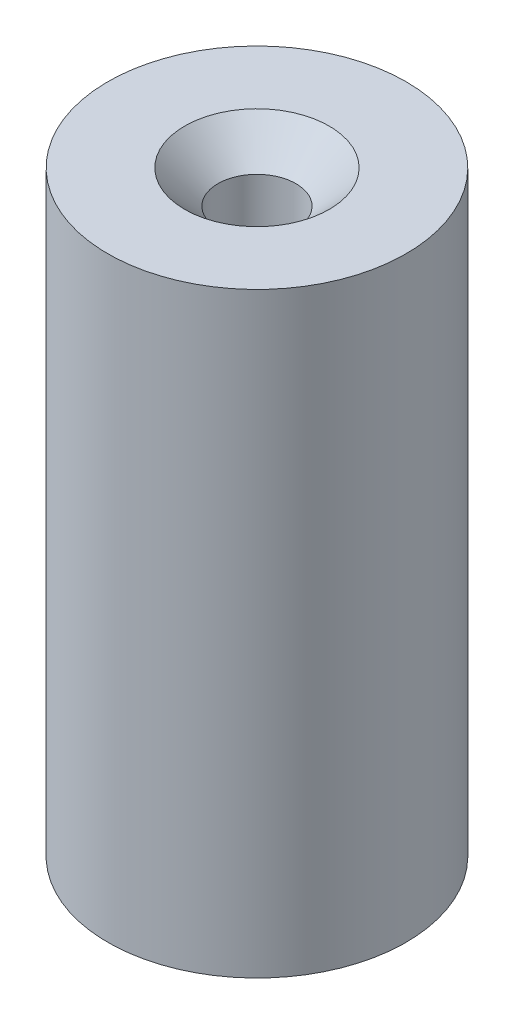
ISO-10303-21;
HEADER;
FILE_DESCRIPTION(('STEP AP214'),'2;1');
FILE_NAME('part.step','',(''),(''),'','','');
FILE_SCHEMA(('AUTOMOTIVE_DESIGN { 1 0 10303 214 1 1 1 1 }'));
ENDSEC;
DATA;
#1=APPLICATION_CONTEXT('core data for automotive mechanical design processes');
#2=APPLICATION_PROTOCOL_DEFINITION('international standard','automotive_design',2000,#1);
#3=PRODUCT_CONTEXT('',#1,'mechanical');
#4=PRODUCT('Part','Part','',(#3));
#5=PRODUCT_RELATED_PRODUCT_CATEGORY('part','',(#4));
#6=PRODUCT_DEFINITION_FORMATION('','',#4);
#7=PRODUCT_DEFINITION_CONTEXT('part definition',#1,'design');
#8=PRODUCT_DEFINITION('design','',#6,#7);
#9=PRODUCT_DEFINITION_SHAPE('','',#8);
#10=(LENGTH_UNIT() NAMED_UNIT(*) SI_UNIT(.MILLI.,.METRE.));
#11=(NAMED_UNIT(*) PLANE_ANGLE_UNIT() SI_UNIT($,.RADIAN.));
#12=(NAMED_UNIT(*) SI_UNIT($,.STERADIAN.) SOLID_ANGLE_UNIT());
#13=UNCERTAINTY_MEASURE_WITH_UNIT(LENGTH_MEASURE(1.E-05),#10,'distance_accuracy_value','');
#14=(GEOMETRIC_REPRESENTATION_CONTEXT(3) GLOBAL_UNCERTAINTY_ASSIGNED_CONTEXT((#13)) GLOBAL_UNIT_ASSIGNED_CONTEXT((#10,
#11,#12)) REPRESENTATION_CONTEXT('',''));
#15=CARTESIAN_POINT('',(0.,0.,0.));
#16=DIRECTION('',(0.,0.,1.));
#17=DIRECTION('',(1.,0.,0.));
#18=AXIS2_PLACEMENT_3D('',#15,#16,#17);
#19=CARTESIAN_POINT('',(0.,26.,0.));
#20=DIRECTION('',(0.,-1.,0.));
#21=DIRECTION('',(0.,0.,-1.));
#22=AXIS2_PLACEMENT_3D('',#19,#20,#21);
#23=CYLINDRICAL_SURFACE('',#22,6.5);
#24=CARTESIAN_POINT('',(0.,26.,0.));
#25=DIRECTION('',(0.,1.,0.));
#26=DIRECTION('',(0.,0.,1.));
#27=AXIS2_PLACEMENT_3D('',#24,#25,#26);
#28=CIRCLE('',#27,6.5);
#29=CARTESIAN_POINT('',(0.,26.,-6.5));
#30=VERTEX_POINT('',#29);
#31=EDGE_CURVE('E10',#30,#30,#28,.T.);
#32=CARTESIAN_POINT('',(0.,0.,0.));
#33=DIRECTION('',(0.,1.,0.));
#34=DIRECTION('',(0.,0.,1.));
#35=AXIS2_PLACEMENT_3D('',#32,#33,#34);
#36=CIRCLE('',#35,6.5);
#37=CARTESIAN_POINT('',(0.,0.,-6.5));
#38=VERTEX_POINT('',#37);
#39=EDGE_CURVE('E42',#38,#38,#36,.T.);
#40=CARTESIAN_POINT('',(0.,26.,-6.5));
#41=CARTESIAN_POINT('',(0.,25.7291666666667,-6.5));
#42=CARTESIAN_POINT('',(0.,25.4583333333333,-6.5));
#43=CARTESIAN_POINT('',(0.,24.9166666666667,-6.5));
#44=CARTESIAN_POINT('',(0.,24.6458333333333,-6.5));
#45=CARTESIAN_POINT('',(0.,24.1041666666667,-6.5));
#46=CARTESIAN_POINT('',(0.,23.8333333333333,-6.5));
#47=CARTESIAN_POINT('',(0.,23.2916666666667,-6.5));
#48=CARTESIAN_POINT('',(0.,23.0208333333333,-6.5));
#49=CARTESIAN_POINT('',(0.,22.4791666666667,-6.5));
#50=CARTESIAN_POINT('',(0.,22.2083333333333,-6.5));
#51=CARTESIAN_POINT('',(0.,21.6666666666667,-6.5));
#52=CARTESIAN_POINT('',(0.,21.3958333333333,-6.5));
#53=CARTESIAN_POINT('',(0.,20.8541666666667,-6.5));
#54=CARTESIAN_POINT('',(0.,20.5833333333333,-6.5));
#55=CARTESIAN_POINT('',(0.,20.0416666666667,-6.5));
#56=CARTESIAN_POINT('',(0.,19.7708333333333,-6.5));
#57=CARTESIAN_POINT('',(0.,19.2291666666667,-6.5));
#58=CARTESIAN_POINT('',(0.,18.9583333333333,-6.5));
#59=CARTESIAN_POINT('',(0.,18.4166666666667,-6.5));
#60=CARTESIAN_POINT('',(0.,18.1458333333333,-6.5));
#61=CARTESIAN_POINT('',(0.,17.6041666666667,-6.5));
#62=CARTESIAN_POINT('',(0.,17.3333333333333,-6.5));
#63=CARTESIAN_POINT('',(0.,16.7916666666667,-6.5));
#64=CARTESIAN_POINT('',(0.,16.5208333333333,-6.5));
#65=CARTESIAN_POINT('',(0.,15.9791666666667,-6.5));
#66=CARTESIAN_POINT('',(0.,15.7083333333333,-6.5));
#67=CARTESIAN_POINT('',(0.,15.1666666666667,-6.5));
#68=CARTESIAN_POINT('',(0.,14.8958333333333,-6.5));
#69=CARTESIAN_POINT('',(0.,14.3541666666667,-6.5));
#70=CARTESIAN_POINT('',(0.,14.0833333333333,-6.5));
#71=CARTESIAN_POINT('',(0.,13.5416666666667,-6.5));
#72=CARTESIAN_POINT('',(0.,13.2708333333333,-6.5));
#73=CARTESIAN_POINT('',(0.,12.7291666666667,-6.5));
#74=CARTESIAN_POINT('',(0.,12.4583333333333,-6.5));
#75=CARTESIAN_POINT('',(0.,11.9166666666667,-6.5));
#76=CARTESIAN_POINT('',(0.,11.6458333333333,-6.5));
#77=CARTESIAN_POINT('',(0.,11.1041666666667,-6.5));
#78=CARTESIAN_POINT('',(0.,10.8333333333333,-6.5));
#79=CARTESIAN_POINT('',(0.,10.2916666666667,-6.5));
#80=CARTESIAN_POINT('',(0.,10.0208333333333,-6.5));
#81=CARTESIAN_POINT('',(0.,9.47916666666667,-6.5));
#82=CARTESIAN_POINT('',(0.,9.20833333333333,-6.5));
#83=CARTESIAN_POINT('',(0.,8.66666666666667,-6.5));
#84=CARTESIAN_POINT('',(0.,8.39583333333333,-6.5));
#85=CARTESIAN_POINT('',(0.,7.85416666666667,-6.5));
#86=CARTESIAN_POINT('',(0.,7.58333333333333,-6.5));
#87=CARTESIAN_POINT('',(0.,7.04166666666667,-6.5));
#88=CARTESIAN_POINT('',(0.,6.77083333333333,-6.5));
#89=CARTESIAN_POINT('',(0.,6.22916666666667,-6.5));
#90=CARTESIAN_POINT('',(0.,5.95833333333333,-6.5));
#91=CARTESIAN_POINT('',(0.,5.41666666666667,-6.5));
#92=CARTESIAN_POINT('',(0.,5.14583333333333,-6.5));
#93=CARTESIAN_POINT('',(0.,4.60416666666667,-6.5));
#94=CARTESIAN_POINT('',(0.,4.33333333333333,-6.5));
#95=CARTESIAN_POINT('',(0.,3.79166666666667,-6.5));
#96=CARTESIAN_POINT('',(0.,3.52083333333333,-6.5));
#97=CARTESIAN_POINT('',(0.,2.97916666666667,-6.5));
#98=CARTESIAN_POINT('',(0.,2.70833333333333,-6.5));
#99=CARTESIAN_POINT('',(0.,2.16666666666667,-6.5));
#100=CARTESIAN_POINT('',(0.,1.89583333333333,-6.5));
#101=CARTESIAN_POINT('',(0.,1.35416666666667,-6.5));
#102=CARTESIAN_POINT('',(0.,1.08333333333333,-6.5));
#103=CARTESIAN_POINT('',(0.,0.541666666666667,-6.5));
#104=CARTESIAN_POINT('',(0.,0.270833333333334,-6.5));
#105=CARTESIAN_POINT('',(0.,0.,-6.5));
#106=B_SPLINE_CURVE_WITH_KNOTS('',3,(#40,#41,#42,#43,#44,#45,#46,#47,#48,#49,#50,#51,#52,#53,
#54,#55,#56,#57,#58,#59,#60,#61,#62,#63,#64,#65,#66,#67,#68,#69,#70,#71,#72,#73,#74,#75,#76,#77,
#78,#79,#80,#81,#82,#83,#84,#85,#86,#87,#88,#89,#90,#91,#92,#93,#94,#95,#96,#97,#98,#99,#100,
#101,#102,#103,#104,#105),.UNSPECIFIED.,.F.,.F.,(4,2,2,2,2,2,2,2,2,2,2,2,2,2,2,2,2,2,2,2,2,2,2,
2,2,2,2,2,2,2,2,2,4),(0.,0.812499999999997,1.625,2.4375,3.25,4.0625,4.875,5.6875,6.5,7.3125,
8.125,8.93749999999999,9.74999999999999,10.5625,11.375,12.1875,13.,13.8125,14.625,15.4375,16.25,
17.0625,17.875,18.6875,19.5,20.3125,21.125,21.9375,22.75,23.5625,24.375,25.1875,26.),.UNSPECIFIED.);
#107=EDGE_CURVE('BSEAM35',#30,#38,#106,.T.);
#108=ORIENTED_EDGE('',*,*,#31,.F.);
#109=ORIENTED_EDGE('',*,*,#39,.T.);
#110=ORIENTED_EDGE('',*,*,#107,.T.);
#111=ORIENTED_EDGE('',*,*,#107,.F.);
#112=EDGE_LOOP('',(#108,#110,#109,#111));
#113=FACE_BOUND('',#112,.T.);
#114=ADVANCED_FACE('F35',(#113),#23,.T.);
#115=CARTESIAN_POINT('',(0.,26.,0.));
#116=DIRECTION('',(0.,1.,0.));
#117=DIRECTION('',(0.,0.,1.));
#118=AXIS2_PLACEMENT_3D('',#115,#116,#117);
#119=PLANE('',#118);
#120=CARTESIAN_POINT('',(0.,26.,0.));
#121=DIRECTION('',(0.,1.,0.));
#122=DIRECTION('',(0.,0.,1.));
#123=AXIS2_PLACEMENT_3D('',#120,#121,#122);
#124=CIRCLE('',#123,3.15);
#125=CARTESIAN_POINT('',(0.,26.,3.15));
#126=VERTEX_POINT('',#125);
#127=EDGE_CURVE('E57',#126,#126,#124,.T.);
#128=ORIENTED_EDGE('',*,*,#127,.F.);
#129=EDGE_LOOP('',(#128));
#130=FACE_BOUND('',#129,.T.);
#131=ORIENTED_EDGE('',*,*,#31,.T.);
#132=EDGE_LOOP('',(#131));
#133=FACE_BOUND('',#132,.T.);
#134=ADVANCED_FACE('F63',(#130,#133),#119,.T.);
#135=CARTESIAN_POINT('',(0.,0.,0.));
#136=DIRECTION('',(0.,1.,0.));
#137=DIRECTION('',(0.,0.,1.));
#138=AXIS2_PLACEMENT_3D('',#135,#136,#137);
#139=PLANE('',#138);
#140=CARTESIAN_POINT('',(0.,0.,0.));
#141=DIRECTION('',(0.,-1.,0.));
#142=DIRECTION('',(0.,0.,-1.));
#143=AXIS2_PLACEMENT_3D('',#140,#141,#142);
#144=CIRCLE('',#143,2.85);
#145=CARTESIAN_POINT('',(0.,0.,-2.85));
#146=VERTEX_POINT('',#145);
#147=EDGE_CURVE('E49',#146,#146,#144,.T.);
#148=ORIENTED_EDGE('',*,*,#147,.F.);
#149=EDGE_LOOP('',(#148));
#150=FACE_BOUND('',#149,.T.);
#151=ORIENTED_EDGE('',*,*,#39,.F.);
#152=EDGE_LOOP('',(#151));
#153=FACE_BOUND('',#152,.T.);
#154=ADVANCED_FACE('F65',(#150,#153),#139,.F.);
#155=CARTESIAN_POINT('',(0.,3.5,0.));
#156=DIRECTION('',(0.,-1.,0.));
#157=DIRECTION('',(0.,0.,-1.));
#158=AXIS2_PLACEMENT_3D('',#155,#156,#157);
#159=CYLINDRICAL_SURFACE('',#158,2.85);
#160=CARTESIAN_POINT('',(0.,3.5,0.));
#161=DIRECTION('',(0.,-1.,0.));
#162=DIRECTION('',(0.,0.,-1.));
#163=AXIS2_PLACEMENT_3D('',#160,#161,#162);
#164=CIRCLE('',#163,2.85);
#165=CARTESIAN_POINT('',(0.,3.5,-2.85));
#166=VERTEX_POINT('',#165);
#167=EDGE_CURVE('E47',#166,#166,#164,.T.);
#168=ORIENTED_EDGE('',*,*,#167,.F.);
#169=EDGE_LOOP('',(#168));
#170=FACE_BOUND('',#169,.T.);
#171=ORIENTED_EDGE('',*,*,#147,.T.);
#172=EDGE_LOOP('',(#171));
#173=FACE_BOUND('',#172,.T.);
#174=ADVANCED_FACE('F71',(#170,#173),#159,.F.);
#175=CARTESIAN_POINT('',(0.,3.5,0.));
#176=DIRECTION('',(0.,-1.,0.));
#177=DIRECTION('',(0.,0.,-1.));
#178=AXIS2_PLACEMENT_3D('',#175,#176,#177);
#179=PLANE('',#178);
#180=CARTESIAN_POINT('',(0.,3.5,0.));
#181=DIRECTION('',(0.,-1.,0.));
#182=DIRECTION('',(0.,0.,-1.));
#183=AXIS2_PLACEMENT_3D('',#180,#181,#182);
#184=CIRCLE('',#183,1.69999999999999);
#185=CARTESIAN_POINT('',(0.,3.5,-1.69999999999999));
#186=VERTEX_POINT('',#185);
#187=EDGE_CURVE('E38',#186,#186,#184,.T.);
#188=ORIENTED_EDGE('',*,*,#187,.F.);
#189=EDGE_LOOP('',(#188));
#190=FACE_BOUND('',#189,.T.);
#191=ORIENTED_EDGE('',*,*,#167,.T.);
#192=EDGE_LOOP('',(#191));
#193=FACE_BOUND('',#192,.T.);
#194=ADVANCED_FACE('F77',(#190,#193),#179,.T.);
#195=CARTESIAN_POINT('',(0.,26.,0.));
#196=DIRECTION('',(0.,1.,0.));
#197=DIRECTION('',(0.,0.,1.));
#198=AXIS2_PLACEMENT_3D('',#195,#196,#197);
#199=CYLINDRICAL_SURFACE('',#198,1.69999999999999);
#200=ORIENTED_EDGE('',*,*,#187,.T.);
#201=EDGE_LOOP('',(#200));
#202=FACE_BOUND('',#201,.T.);
#203=CARTESIAN_POINT('',(0.,24.55,0.));
#204=DIRECTION('',(0.,1.,0.));
#205=DIRECTION('',(0.,0.,1.));
#206=AXIS2_PLACEMENT_3D('',#203,#204,#205);
#207=CIRCLE('',#206,1.69999999999999);
#208=CARTESIAN_POINT('',(0.,24.55,1.69999999999999));
#209=VERTEX_POINT('',#208);
#210=EDGE_CURVE('E54',#209,#209,#207,.T.);
#211=ORIENTED_EDGE('',*,*,#210,.T.);
#212=EDGE_LOOP('',(#211));
#213=FACE_BOUND('',#212,.T.);
#214=ADVANCED_FACE('F81',(#202,#213),#199,.F.);
#215=CARTESIAN_POINT('',(0.,26.,0.));
#216=DIRECTION('',(0.,1.,0.));
#217=DIRECTION('',(0.,0.,1.));
#218=AXIS2_PLACEMENT_3D('',#215,#216,#217);
#219=CONICAL_SURFACE('',#218,3.15,0.785398163397449);
#220=ORIENTED_EDGE('',*,*,#210,.F.);
#221=EDGE_LOOP('',(#220));
#222=FACE_BOUND('',#221,.T.);
#223=ORIENTED_EDGE('',*,*,#127,.T.);
#224=EDGE_LOOP('',(#223));
#225=FACE_BOUND('',#224,.T.);
#226=ADVANCED_FACE('F61',(#222,#225),#219,.F.);
#227=CLOSED_SHELL('',(#114,#134,#154,#174,#194,#214,#226));
#228=MANIFOLD_SOLID_BREP('B2',#227);
#229=ADVANCED_BREP_SHAPE_REPRESENTATION('',(#18,#228),#14);
#230=SHAPE_DEFINITION_REPRESENTATION(#9,#229);
ENDSEC;
END-ISO-10303-21;
